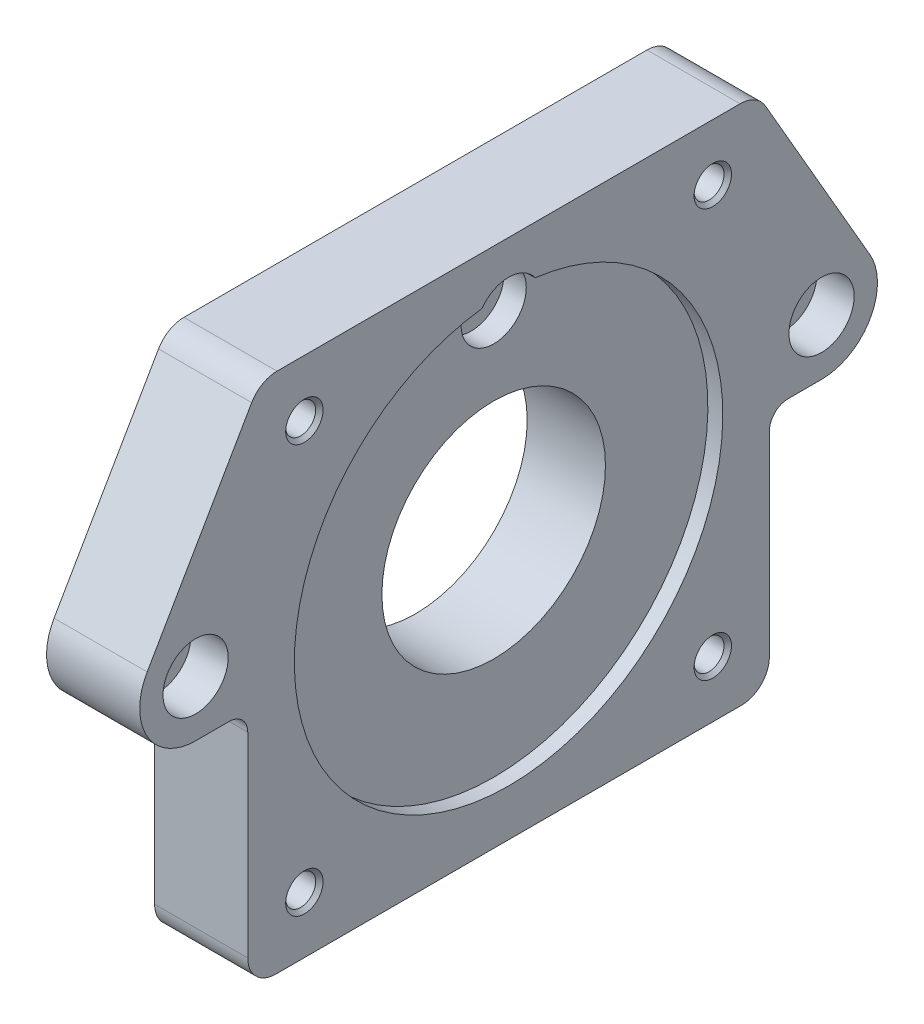
ISO-10303-21;
HEADER;
FILE_DESCRIPTION(('STEP AP214'),'2;1');
FILE_NAME('part.step','',(''),(''),'','','');
FILE_SCHEMA(('AUTOMOTIVE_DESIGN { 1 0 10303 214 1 1 1 1 }'));
ENDSEC;
DATA;
#1=APPLICATION_CONTEXT('core data for automotive mechanical design processes');
#2=APPLICATION_PROTOCOL_DEFINITION('international standard','automotive_design',2000,#1);
#3=PRODUCT_CONTEXT('',#1,'mechanical');
#4=PRODUCT('Part','Part','',(#3));
#5=PRODUCT_RELATED_PRODUCT_CATEGORY('part','',(#4));
#6=PRODUCT_DEFINITION_FORMATION('','',#4);
#7=PRODUCT_DEFINITION_CONTEXT('part definition',#1,'design');
#8=PRODUCT_DEFINITION('design','',#6,#7);
#9=PRODUCT_DEFINITION_SHAPE('','',#8);
#10=(LENGTH_UNIT() NAMED_UNIT(*) SI_UNIT(.MILLI.,.METRE.));
#11=(NAMED_UNIT(*) PLANE_ANGLE_UNIT() SI_UNIT($,.RADIAN.));
#12=(NAMED_UNIT(*) SI_UNIT($,.STERADIAN.) SOLID_ANGLE_UNIT());
#13=UNCERTAINTY_MEASURE_WITH_UNIT(LENGTH_MEASURE(1.E-05),#10,'distance_accuracy_value','');
#14=(GEOMETRIC_REPRESENTATION_CONTEXT(3) GLOBAL_UNCERTAINTY_ASSIGNED_CONTEXT((#13)) GLOBAL_UNIT_ASSIGNED_CONTEXT((#10,
#11,#12)) REPRESENTATION_CONTEXT('',''));
#15=CARTESIAN_POINT('',(0.,0.,0.));
#16=DIRECTION('',(0.,0.,1.));
#17=DIRECTION('',(1.,0.,0.));
#18=AXIS2_PLACEMENT_3D('',#15,#16,#17);
#19=CARTESIAN_POINT('',(15.875,6.35,-53.34));
#20=DIRECTION('',(-1.,0.,0.));
#21=DIRECTION('',(0.,0.,1.));
#22=AXIS2_PLACEMENT_3D('',#19,#20,#21);
#23=PLANE('',#22);
#24=CARTESIAN_POINT('',(15.875,-34.8,-34.8));
#25=DIRECTION('',(1.,0.,0.));
#26=DIRECTION('',(0.,0.,-1.));
#27=AXIS2_PLACEMENT_3D('',#24,#25,#26);
#28=CIRCLE('',#27,3.1877);
#29=CARTESIAN_POINT('',(15.875,-34.8,-37.9877));
#30=VERTEX_POINT('',#29);
#31=EDGE_CURVE('E833',#30,#30,#28,.T.);
#32=ORIENTED_EDGE('',*,*,#31,.F.);
#33=EDGE_LOOP('',(#32));
#34=FACE_BOUND('',#33,.T.);
#35=CARTESIAN_POINT('',(15.875,34.8,34.8));
#36=DIRECTION('',(1.,0.,0.));
#37=DIRECTION('',(0.,0.,-1.));
#38=AXIS2_PLACEMENT_3D('',#35,#36,#37);
#39=CIRCLE('',#38,3.1877);
#40=CARTESIAN_POINT('',(15.875,34.8,31.6123));
#41=VERTEX_POINT('',#40);
#42=EDGE_CURVE('E321',#41,#41,#39,.T.);
#43=ORIENTED_EDGE('',*,*,#42,.F.);
#44=EDGE_LOOP('',(#43));
#45=FACE_BOUND('',#44,.T.);
#46=CARTESIAN_POINT('',(15.875,34.8,-34.8));
#47=DIRECTION('',(1.,0.,0.));
#48=DIRECTION('',(0.,0.,-1.));
#49=AXIS2_PLACEMENT_3D('',#46,#47,#48);
#50=CIRCLE('',#49,3.1877);
#51=CARTESIAN_POINT('',(15.875,34.8,-37.9877));
#52=VERTEX_POINT('',#51);
#53=EDGE_CURVE('E310',#52,#52,#50,.T.);
#54=ORIENTED_EDGE('',*,*,#53,.F.);
#55=EDGE_LOOP('',(#54));
#56=FACE_BOUND('',#55,.T.);
#57=CARTESIAN_POINT('',(15.875,6.35,53.34));
#58=DIRECTION('',(1.,0.,0.));
#59=DIRECTION('',(0.,0.,-1.));
#60=AXIS2_PLACEMENT_3D('',#57,#58,#59);
#61=CIRCLE('',#60,5.55625);
#62=CARTESIAN_POINT('',(15.875,6.35,47.78375));
#63=VERTEX_POINT('',#62);
#64=EDGE_CURVE('E306',#63,#63,#61,.T.);
#65=ORIENTED_EDGE('',*,*,#64,.F.);
#66=EDGE_LOOP('',(#65));
#67=FACE_BOUND('',#66,.T.);
#68=CARTESIAN_POINT('',(15.875,6.35,-53.34));
#69=DIRECTION('',(1.,0.,0.));
#70=DIRECTION('',(0.,0.,-1.));
#71=AXIS2_PLACEMENT_3D('',#68,#69,#70);
#72=CIRCLE('',#71,5.55625);
#73=CARTESIAN_POINT('',(15.875,6.35,-58.89625));
#74=VERTEX_POINT('',#73);
#75=EDGE_CURVE('E346',#74,#74,#72,.T.);
#76=ORIENTED_EDGE('',*,*,#75,.F.);
#77=EDGE_LOOP('',(#76));
#78=FACE_BOUND('',#77,.T.);
#79=CARTESIAN_POINT('',(15.875,0.,0.));
#80=DIRECTION('',(1.,0.,0.));
#81=DIRECTION('',(0.,0.,-1.));
#82=AXIS2_PLACEMENT_3D('',#79,#80,#81);
#83=CIRCLE('',#82,36.5099981);
#84=CARTESIAN_POINT('',(15.875,36.2269601332451,4.53732528768621));
#85=VERTEX_POINT('',#84);
#86=CARTESIAN_POINT('',(15.875,36.2269601332451,-4.53732528768621));
#87=VERTEX_POINT('',#86);
#88=EDGE_CURVE('E173',#85,#87,#83,.T.);
#89=ORIENTED_EDGE('',*,*,#88,.F.);
#90=CARTESIAN_POINT('',(15.875,33.02,0.));
#91=DIRECTION('',(1.,0.,0.));
#92=DIRECTION('',(0.,0.,-1.));
#93=AXIS2_PLACEMENT_3D('',#90,#91,#92);
#94=CIRCLE('',#93,5.55625);
#95=EDGE_CURVE('E164',#87,#85,#94,.T.);
#96=ORIENTED_EDGE('',*,*,#95,.F.);
#97=EDGE_LOOP('',(#89,#96));
#98=FACE_BOUND('',#97,.T.);
#99=DIRECTION('',(0.,0.,-1.));
#100=VECTOR('',#99,1.);
#101=CARTESIAN_POINT('',(15.875,-44.45,44.45));
#102=LINE('',#101,#100);
#103=CARTESIAN_POINT('',(15.875,-44.45,39.6748));
#104=VERTEX_POINT('',#103);
#105=CARTESIAN_POINT('',(15.875,-44.45,-39.6748));
#106=VERTEX_POINT('',#105);
#107=EDGE_CURVE('E189',#104,#106,#102,.T.);
#108=ORIENTED_EDGE('',*,*,#107,.T.);
#109=CARTESIAN_POINT('',(15.875,-39.6748,-39.6748));
#110=DIRECTION('',(-1.,0.,0.));
#111=DIRECTION('',(0.,0.,1.));
#112=AXIS2_PLACEMENT_3D('',#109,#110,#111);
#113=CIRCLE('',#112,4.7752);
#114=CARTESIAN_POINT('',(15.875,-39.6748,-44.45));
#115=VERTEX_POINT('',#114);
#116=EDGE_CURVE('E298',#106,#115,#113,.F.);
#117=ORIENTED_EDGE('',*,*,#116,.T.);
#118=DIRECTION('',(0.,1.,0.));
#119=VECTOR('',#118,1.);
#120=CARTESIAN_POINT('',(15.875,-44.45,-44.45));
#121=LINE('',#120,#119);
#122=CARTESIAN_POINT('',(15.875,-6.35000000000001,-44.45));
#123=VERTEX_POINT('',#122);
#124=EDGE_CURVE('E192',#115,#123,#121,.T.);
#125=ORIENTED_EDGE('',*,*,#124,.T.);
#126=CARTESIAN_POINT('',(15.875,-6.35000000000001,-47.625));
#127=DIRECTION('',(-1.,0.,0.));
#128=DIRECTION('',(0.,0.,1.));
#129=AXIS2_PLACEMENT_3D('',#126,#127,#128);
#130=CIRCLE('',#129,3.175);
#131=CARTESIAN_POINT('',(15.875,-3.17500000000001,-47.625));
#132=VERTEX_POINT('',#131);
#133=EDGE_CURVE('E278',#123,#132,#130,.T.);
#134=ORIENTED_EDGE('',*,*,#133,.T.);
#135=DIRECTION('',(0.,0.,-1.));
#136=VECTOR('',#135,1.);
#137=CARTESIAN_POINT('',(15.875,-3.175,-53.34));
#138=LINE('',#137,#136);
#139=CARTESIAN_POINT('',(15.875,-3.17500000000001,-53.34));
#140=VERTEX_POINT('',#139);
#141=EDGE_CURVE('E195',#132,#140,#138,.T.);
#142=ORIENTED_EDGE('',*,*,#141,.T.);
#143=CARTESIAN_POINT('',(15.875,6.35,-53.34));
#144=DIRECTION('',(1.,0.,0.));
#145=DIRECTION('',(0.,0.,1.));
#146=AXIS2_PLACEMENT_3D('',#143,#144,#145);
#147=CIRCLE('',#146,9.525);
#148=CARTESIAN_POINT('',(15.875,11.1125,-61.5888919710468));
#149=VERTEX_POINT('',#148);
#150=EDGE_CURVE('E197',#140,#149,#147,.T.);
#151=ORIENTED_EDGE('',*,*,#150,.T.);
#152=DIRECTION('',(0.,0.866025403784436,0.500000000000004));
#153=VECTOR('',#152,1.);
#154=CARTESIAN_POINT('',(15.875,41.9555909487749,-43.7816251091313));
#155=LINE('',#154,#153);
#156=CARTESIAN_POINT('',(15.875,41.9555909487749,-43.7816251091313));
#157=VERTEX_POINT('',#156);
#158=EDGE_CURVE('E199',#149,#157,#155,.T.);
#159=ORIENTED_EDGE('',*,*,#158,.T.);
#160=CARTESIAN_POINT('',(15.875,39.4611818975497,-39.4611818975497));
#161=DIRECTION('',(1.,0.,0.));
#162=DIRECTION('',(0.,0.,1.));
#163=AXIS2_PLACEMENT_3D('',#160,#161,#162);
#164=CIRCLE('',#163,4.9888181024503);
#165=CARTESIAN_POINT('',(15.875,44.45,-39.4611818975497));
#166=VERTEX_POINT('',#165);
#167=EDGE_CURVE('E201',#157,#166,#164,.T.);
#168=ORIENTED_EDGE('',*,*,#167,.T.);
#169=DIRECTION('',(0.,0.,1.));
#170=VECTOR('',#169,1.);
#171=CARTESIAN_POINT('',(15.875,44.45,39.4611818975497));
#172=LINE('',#171,#170);
#173=CARTESIAN_POINT('',(15.875,44.45,39.4611818975497));
#174=VERTEX_POINT('',#173);
#175=EDGE_CURVE('E203',#166,#174,#172,.T.);
#176=ORIENTED_EDGE('',*,*,#175,.T.);
#177=CARTESIAN_POINT('',(15.875,39.4611818975497,39.4611818975497));
#178=DIRECTION('',(1.,0.,0.));
#179=DIRECTION('',(0.,0.,-1.));
#180=AXIS2_PLACEMENT_3D('',#177,#178,#179);
#181=CIRCLE('',#180,4.9888181024503);
#182=CARTESIAN_POINT('',(15.875,41.9555909487749,43.7816251091313));
#183=VERTEX_POINT('',#182);
#184=EDGE_CURVE('E205',#174,#183,#181,.T.);
#185=ORIENTED_EDGE('',*,*,#184,.T.);
#186=DIRECTION('',(0.,-0.866025403784436,0.500000000000004));
#187=VECTOR('',#186,1.);
#188=CARTESIAN_POINT('',(15.875,41.9555909487749,43.7816251091313));
#189=LINE('',#188,#187);
#190=CARTESIAN_POINT('',(15.875,11.1125,61.5888919710468));
#191=VERTEX_POINT('',#190);
#192=EDGE_CURVE('E207',#183,#191,#189,.T.);
#193=ORIENTED_EDGE('',*,*,#192,.T.);
#194=CARTESIAN_POINT('',(15.875,6.35,53.34));
#195=DIRECTION('',(1.,0.,0.));
#196=DIRECTION('',(0.,0.,1.));
#197=AXIS2_PLACEMENT_3D('',#194,#195,#196);
#198=CIRCLE('',#197,9.525);
#199=CARTESIAN_POINT('',(15.875,-3.175,53.34));
#200=VERTEX_POINT('',#199);
#201=EDGE_CURVE('E209',#191,#200,#198,.T.);
#202=ORIENTED_EDGE('',*,*,#201,.T.);
#203=DIRECTION('',(0.,0.,-1.));
#204=VECTOR('',#203,1.);
#205=CARTESIAN_POINT('',(15.875,-3.175,53.34));
#206=LINE('',#205,#204);
#207=CARTESIAN_POINT('',(15.875,-3.17500000000001,47.625));
#208=VERTEX_POINT('',#207);
#209=EDGE_CURVE('E211',#200,#208,#206,.T.);
#210=ORIENTED_EDGE('',*,*,#209,.T.);
#211=CARTESIAN_POINT('',(15.875,-6.35000000000001,47.625));
#212=DIRECTION('',(-1.,0.,0.));
#213=DIRECTION('',(0.,0.,1.));
#214=AXIS2_PLACEMENT_3D('',#211,#212,#213);
#215=CIRCLE('',#214,3.175);
#216=CARTESIAN_POINT('',(15.875,-6.35000000000001,44.45));
#217=VERTEX_POINT('',#216);
#218=EDGE_CURVE('E282',#208,#217,#215,.T.);
#219=ORIENTED_EDGE('',*,*,#218,.T.);
#220=DIRECTION('',(0.,-1.,0.));
#221=VECTOR('',#220,1.);
#222=CARTESIAN_POINT('',(15.875,-3.17500000000002,44.45));
#223=LINE('',#222,#221);
#224=CARTESIAN_POINT('',(15.875,-39.6748,44.45));
#225=VERTEX_POINT('',#224);
#226=EDGE_CURVE('E214',#217,#225,#223,.T.);
#227=ORIENTED_EDGE('',*,*,#226,.T.);
#228=CARTESIAN_POINT('',(15.875,-39.6748,39.6748));
#229=DIRECTION('',(-1.,0.,0.));
#230=DIRECTION('',(0.,0.,1.));
#231=AXIS2_PLACEMENT_3D('',#228,#229,#230);
#232=CIRCLE('',#231,4.7752);
#233=EDGE_CURVE('E296',#225,#104,#232,.F.);
#234=ORIENTED_EDGE('',*,*,#233,.T.);
#235=EDGE_LOOP('',(#108,#117,#125,#134,#142,#151,#159,#168,#176,#185,#193,#202,#210,#219,#227,#234));
#236=FACE_BOUND('',#235,.T.);
#237=CARTESIAN_POINT('',(15.875,-34.8,34.8));
#238=DIRECTION('',(1.,0.,0.));
#239=DIRECTION('',(0.,0.,-1.));
#240=AXIS2_PLACEMENT_3D('',#237,#238,#239);
#241=CIRCLE('',#240,3.1877);
#242=CARTESIAN_POINT('',(15.875,-34.8,31.6123));
#243=VERTEX_POINT('',#242);
#244=EDGE_CURVE('E314',#243,#243,#241,.T.);
#245=ORIENTED_EDGE('',*,*,#244,.F.);
#246=EDGE_LOOP('',(#245));
#247=FACE_BOUND('',#246,.T.);
#248=ADVANCED_FACE('F36',(#34,#45,#56,#67,#78,#98,#236,#247),#23,.F.);
#249=CARTESIAN_POINT('',(15.875,0.,0.));
#250=DIRECTION('',(-1.,0.,0.));
#251=DIRECTION('',(0.,0.,1.));
#252=AXIS2_PLACEMENT_3D('',#249,#250,#251);
#253=CYLINDRICAL_SURFACE('',#252,19.05);
#254=CARTESIAN_POINT('',(0.,0.,0.));
#255=DIRECTION('',(1.,0.,0.));
#256=DIRECTION('',(0.,0.,-1.));
#257=AXIS2_PLACEMENT_3D('',#254,#255,#256);
#258=CIRCLE('',#257,19.05);
#259=CARTESIAN_POINT('',(0.,0.,-19.05));
#260=VERTEX_POINT('',#259);
#261=EDGE_CURVE('E185',#260,#260,#258,.T.);
#262=ORIENTED_EDGE('',*,*,#261,.F.);
#263=EDGE_LOOP('',(#262));
#264=FACE_BOUND('',#263,.T.);
#265=CARTESIAN_POINT('',(13.335,0.,0.));
#266=DIRECTION('',(1.,0.,0.));
#267=DIRECTION('',(0.,0.,-1.));
#268=AXIS2_PLACEMENT_3D('',#265,#266,#267);
#269=CIRCLE('',#268,19.05);
#270=CARTESIAN_POINT('',(13.335,0.,-19.05));
#271=VERTEX_POINT('',#270);
#272=EDGE_CURVE('E180',#271,#271,#269,.T.);
#273=ORIENTED_EDGE('',*,*,#272,.T.);
#274=EDGE_LOOP('',(#273));
#275=FACE_BOUND('',#274,.T.);
#276=ADVANCED_FACE('F391',(#264,#275),#253,.F.);
#277=CARTESIAN_POINT('',(0.,6.35,-53.34));
#278=DIRECTION('',(-1.,0.,0.));
#279=DIRECTION('',(0.,0.,1.));
#280=AXIS2_PLACEMENT_3D('',#277,#278,#279);
#281=PLANE('',#280);
#282=CARTESIAN_POINT('',(0.,-34.8,-34.8));
#283=DIRECTION('',(-1.,0.,0.));
#284=DIRECTION('',(0.,0.,1.));
#285=AXIS2_PLACEMENT_3D('',#282,#283,#284);
#286=CIRCLE('',#285,2.55269999999999);
#287=CARTESIAN_POINT('',(0.,-34.8,-32.2473));
#288=VERTEX_POINT('',#287);
#289=EDGE_CURVE('E40',#288,#288,#286,.T.);
#290=ORIENTED_EDGE('',*,*,#289,.F.);
#291=EDGE_LOOP('',(#290));
#292=FACE_BOUND('',#291,.T.);
#293=CARTESIAN_POINT('',(0.,34.8,34.8));
#294=DIRECTION('',(-1.,0.,0.));
#295=DIRECTION('',(0.,0.,1.));
#296=AXIS2_PLACEMENT_3D('',#293,#294,#295);
#297=CIRCLE('',#296,2.55269999999999);
#298=CARTESIAN_POINT('',(0.,34.8,37.3527));
#299=VERTEX_POINT('',#298);
#300=EDGE_CURVE('E312',#299,#299,#297,.T.);
#301=ORIENTED_EDGE('',*,*,#300,.F.);
#302=EDGE_LOOP('',(#301));
#303=FACE_BOUND('',#302,.T.);
#304=CARTESIAN_POINT('',(0.,-34.8,34.8));
#305=DIRECTION('',(-1.,0.,0.));
#306=DIRECTION('',(0.,0.,1.));
#307=AXIS2_PLACEMENT_3D('',#304,#305,#306);
#308=CIRCLE('',#307,2.55269999999999);
#309=CARTESIAN_POINT('',(0.,-34.8,37.3527));
#310=VERTEX_POINT('',#309);
#311=EDGE_CURVE('E308',#310,#310,#308,.T.);
#312=ORIENTED_EDGE('',*,*,#311,.F.);
#313=EDGE_LOOP('',(#312));
#314=FACE_BOUND('',#313,.T.);
#315=CARTESIAN_POINT('',(0.,34.8,-34.8));
#316=DIRECTION('',(-1.,0.,0.));
#317=DIRECTION('',(0.,0.,1.));
#318=AXIS2_PLACEMENT_3D('',#315,#316,#317);
#319=CIRCLE('',#318,2.55269999999999);
#320=CARTESIAN_POINT('',(0.,34.8,-32.2473));
#321=VERTEX_POINT('',#320);
#322=EDGE_CURVE('E303',#321,#321,#319,.T.);
#323=ORIENTED_EDGE('',*,*,#322,.F.);
#324=EDGE_LOOP('',(#323));
#325=FACE_BOUND('',#324,.T.);
#326=CARTESIAN_POINT('',(0.,6.35,53.34));
#327=DIRECTION('',(1.,0.,0.));
#328=DIRECTION('',(0.,0.,-1.));
#329=AXIS2_PLACEMENT_3D('',#326,#327,#328);
#330=CIRCLE('',#329,3.2639);
#331=CARTESIAN_POINT('',(0.,6.35,50.0761));
#332=VERTEX_POINT('',#331);
#333=EDGE_CURVE('E343',#332,#332,#330,.T.);
#334=ORIENTED_EDGE('',*,*,#333,.T.);
#335=EDGE_LOOP('',(#334));
#336=FACE_BOUND('',#335,.T.);
#337=CARTESIAN_POINT('',(0.,6.35,-53.34));
#338=DIRECTION('',(1.,0.,0.));
#339=DIRECTION('',(0.,0.,-1.));
#340=AXIS2_PLACEMENT_3D('',#337,#338,#339);
#341=CIRCLE('',#340,3.2639);
#342=CARTESIAN_POINT('',(0.,6.35,-56.6039));
#343=VERTEX_POINT('',#342);
#344=EDGE_CURVE('E175',#343,#343,#341,.T.);
#345=ORIENTED_EDGE('',*,*,#344,.T.);
#346=EDGE_LOOP('',(#345));
#347=FACE_BOUND('',#346,.T.);
#348=CARTESIAN_POINT('',(0.,33.02,0.));
#349=DIRECTION('',(1.,0.,0.));
#350=DIRECTION('',(0.,0.,-1.));
#351=AXIS2_PLACEMENT_3D('',#348,#349,#350);
#352=CIRCLE('',#351,3.26389999999999);
#353=CARTESIAN_POINT('',(0.,33.02,-3.26389999999999));
#354=VERTEX_POINT('',#353);
#355=EDGE_CURVE('E182',#354,#354,#352,.T.);
#356=ORIENTED_EDGE('',*,*,#355,.T.);
#357=EDGE_LOOP('',(#356));
#358=FACE_BOUND('',#357,.T.);
#359=DIRECTION('',(0.,1.,0.));
#360=VECTOR('',#359,1.);
#361=CARTESIAN_POINT('',(0.,-44.45,-44.45));
#362=LINE('',#361,#360);
#363=CARTESIAN_POINT('',(0.,-39.6748,-44.45));
#364=VERTEX_POINT('',#363);
#365=CARTESIAN_POINT('',(0.,-6.35000000000001,-44.45));
#366=VERTEX_POINT('',#365);
#367=EDGE_CURVE('E219',#364,#366,#362,.T.);
#368=ORIENTED_EDGE('',*,*,#367,.F.);
#369=CARTESIAN_POINT('',(0.,-39.6748,-39.6748));
#370=DIRECTION('',(-1.,0.,0.));
#371=DIRECTION('',(0.,0.,1.));
#372=AXIS2_PLACEMENT_3D('',#369,#370,#371);
#373=CIRCLE('',#372,4.7752);
#374=CARTESIAN_POINT('',(0.,-44.45,-39.6748));
#375=VERTEX_POINT('',#374);
#376=EDGE_CURVE('E289',#364,#375,#373,.T.);
#377=ORIENTED_EDGE('',*,*,#376,.T.);
#378=DIRECTION('',(0.,0.,-1.));
#379=VECTOR('',#378,1.);
#380=CARTESIAN_POINT('',(0.,-44.45,44.45));
#381=LINE('',#380,#379);
#382=CARTESIAN_POINT('',(0.,-44.45,39.6748));
#383=VERTEX_POINT('',#382);
#384=EDGE_CURVE('E188',#383,#375,#381,.T.);
#385=ORIENTED_EDGE('',*,*,#384,.F.);
#386=CARTESIAN_POINT('',(0.,-39.6748,39.6748));
#387=DIRECTION('',(-1.,0.,0.));
#388=DIRECTION('',(0.,0.,1.));
#389=AXIS2_PLACEMENT_3D('',#386,#387,#388);
#390=CIRCLE('',#389,4.7752);
#391=CARTESIAN_POINT('',(0.,-39.6748,44.45));
#392=VERTEX_POINT('',#391);
#393=EDGE_CURVE('E287',#383,#392,#390,.T.);
#394=ORIENTED_EDGE('',*,*,#393,.T.);
#395=DIRECTION('',(0.,-1.,0.));
#396=VECTOR('',#395,1.);
#397=CARTESIAN_POINT('',(0.,-3.17500000000002,44.45));
#398=LINE('',#397,#396);
#399=CARTESIAN_POINT('',(0.,-6.35000000000001,44.45));
#400=VERTEX_POINT('',#399);
#401=EDGE_CURVE('E193',#400,#392,#398,.T.);
#402=ORIENTED_EDGE('',*,*,#401,.F.);
#403=CARTESIAN_POINT('',(0.,-6.35000000000001,47.625));
#404=DIRECTION('',(-1.,0.,0.));
#405=DIRECTION('',(0.,0.,1.));
#406=AXIS2_PLACEMENT_3D('',#403,#404,#405);
#407=CIRCLE('',#406,3.175);
#408=CARTESIAN_POINT('',(0.,-3.17500000000001,47.625));
#409=VERTEX_POINT('',#408);
#410=EDGE_CURVE('E280',#400,#409,#407,.F.);
#411=ORIENTED_EDGE('',*,*,#410,.T.);
#412=DIRECTION('',(0.,0.,-1.));
#413=VECTOR('',#412,1.);
#414=CARTESIAN_POINT('',(0.,-3.175,53.34));
#415=LINE('',#414,#413);
#416=CARTESIAN_POINT('',(0.,-3.175,53.34));
#417=VERTEX_POINT('',#416);
#418=EDGE_CURVE('E237',#417,#409,#415,.T.);
#419=ORIENTED_EDGE('',*,*,#418,.F.);
#420=CARTESIAN_POINT('',(0.,6.35,53.34));
#421=DIRECTION('',(1.,0.,0.));
#422=DIRECTION('',(0.,0.,1.));
#423=AXIS2_PLACEMENT_3D('',#420,#421,#422);
#424=CIRCLE('',#423,9.525);
#425=CARTESIAN_POINT('',(0.,11.1125,61.5888919710468));
#426=VERTEX_POINT('',#425);
#427=EDGE_CURVE('E235',#426,#417,#424,.T.);
#428=ORIENTED_EDGE('',*,*,#427,.F.);
#429=DIRECTION('',(0.,-0.866025403784436,0.500000000000004));
#430=VECTOR('',#429,1.);
#431=CARTESIAN_POINT('',(0.,41.9555909487749,43.7816251091313));
#432=LINE('',#431,#430);
#433=CARTESIAN_POINT('',(0.,41.9555909487749,43.7816251091313));
#434=VERTEX_POINT('',#433);
#435=EDGE_CURVE('E233',#434,#426,#432,.T.);
#436=ORIENTED_EDGE('',*,*,#435,.F.);
#437=CARTESIAN_POINT('',(0.,39.4611818975497,39.4611818975497));
#438=DIRECTION('',(1.,0.,0.));
#439=DIRECTION('',(0.,0.,-1.));
#440=AXIS2_PLACEMENT_3D('',#437,#438,#439);
#441=CIRCLE('',#440,4.9888181024503);
#442=CARTESIAN_POINT('',(0.,44.45,39.4611818975497));
#443=VERTEX_POINT('',#442);
#444=EDGE_CURVE('E231',#443,#434,#441,.T.);
#445=ORIENTED_EDGE('',*,*,#444,.F.);
#446=DIRECTION('',(0.,0.,1.));
#447=VECTOR('',#446,1.);
#448=CARTESIAN_POINT('',(0.,44.45,39.4611818975497));
#449=LINE('',#448,#447);
#450=CARTESIAN_POINT('',(0.,44.45,-39.4611818975497));
#451=VERTEX_POINT('',#450);
#452=EDGE_CURVE('E229',#451,#443,#449,.T.);
#453=ORIENTED_EDGE('',*,*,#452,.F.);
#454=CARTESIAN_POINT('',(0.,39.4611818975497,-39.4611818975497));
#455=DIRECTION('',(1.,0.,0.));
#456=DIRECTION('',(0.,0.,1.));
#457=AXIS2_PLACEMENT_3D('',#454,#455,#456);
#458=CIRCLE('',#457,4.9888181024503);
#459=CARTESIAN_POINT('',(0.,41.9555909487749,-43.7816251091313));
#460=VERTEX_POINT('',#459);
#461=EDGE_CURVE('E227',#460,#451,#458,.T.);
#462=ORIENTED_EDGE('',*,*,#461,.F.);
#463=DIRECTION('',(0.,0.866025403784436,0.500000000000004));
#464=VECTOR('',#463,1.);
#465=CARTESIAN_POINT('',(0.,41.9555909487749,-43.7816251091313));
#466=LINE('',#465,#464);
#467=CARTESIAN_POINT('',(0.,11.1125,-61.5888919710468));
#468=VERTEX_POINT('',#467);
#469=EDGE_CURVE('E225',#468,#460,#466,.T.);
#470=ORIENTED_EDGE('',*,*,#469,.F.);
#471=CARTESIAN_POINT('',(0.,6.35,-53.34));
#472=DIRECTION('',(1.,0.,0.));
#473=DIRECTION('',(0.,0.,1.));
#474=AXIS2_PLACEMENT_3D('',#471,#472,#473);
#475=CIRCLE('',#474,9.525);
#476=CARTESIAN_POINT('',(0.,-3.17500000000001,-53.34));
#477=VERTEX_POINT('',#476);
#478=EDGE_CURVE('E223',#477,#468,#475,.T.);
#479=ORIENTED_EDGE('',*,*,#478,.F.);
#480=DIRECTION('',(0.,0.,-1.));
#481=VECTOR('',#480,1.);
#482=CARTESIAN_POINT('',(0.,-3.175,-53.34));
#483=LINE('',#482,#481);
#484=CARTESIAN_POINT('',(0.,-3.17500000000001,-47.625));
#485=VERTEX_POINT('',#484);
#486=EDGE_CURVE('E221',#485,#477,#483,.T.);
#487=ORIENTED_EDGE('',*,*,#486,.F.);
#488=CARTESIAN_POINT('',(0.,-6.35000000000001,-47.625));
#489=DIRECTION('',(-1.,0.,0.));
#490=DIRECTION('',(0.,0.,1.));
#491=AXIS2_PLACEMENT_3D('',#488,#489,#490);
#492=CIRCLE('',#491,3.175);
#493=EDGE_CURVE('E275',#485,#366,#492,.F.);
#494=ORIENTED_EDGE('',*,*,#493,.T.);
#495=EDGE_LOOP('',(#368,#377,#385,#394,#402,#411,#419,#428,#436,#445,#453,#462,#470,#479,#487,#494));
#496=FACE_BOUND('',#495,.T.);
#497=ORIENTED_EDGE('',*,*,#261,.T.);
#498=EDGE_LOOP('',(#497));
#499=FACE_BOUND('',#498,.T.);
#500=ADVANCED_FACE('F365',(#292,#303,#314,#325,#336,#347,#358,#496,#499),#281,.T.);
#501=CARTESIAN_POINT('',(15.875,-44.45,44.45));
#502=DIRECTION('',(0.,1.,0.));
#503=DIRECTION('',(0.,0.,1.));
#504=AXIS2_PLACEMENT_3D('',#501,#502,#503);
#505=PLANE('',#504);
#506=ORIENTED_EDGE('',*,*,#384,.T.);
#507=DIRECTION('',(-1.,0.,0.));
#508=VECTOR('',#507,1.);
#509=CARTESIAN_POINT('',(15.875,-44.45,-39.6748));
#510=LINE('',#509,#508);
#511=EDGE_CURVE('E294',#375,#106,#510,.F.);
#512=ORIENTED_EDGE('',*,*,#511,.T.);
#513=ORIENTED_EDGE('',*,*,#107,.F.);
#514=DIRECTION('',(-1.,0.,0.));
#515=VECTOR('',#514,1.);
#516=CARTESIAN_POINT('',(15.875,-44.45,39.6748));
#517=LINE('',#516,#515);
#518=EDGE_CURVE('E291',#104,#383,#517,.T.);
#519=ORIENTED_EDGE('',*,*,#518,.T.);
#520=EDGE_LOOP('',(#506,#512,#513,#519));
#521=FACE_BOUND('',#520,.T.);
#522=ADVANCED_FACE('F405',(#521),#505,.F.);
#523=CARTESIAN_POINT('',(15.875,-44.45,-44.45));
#524=DIRECTION('',(0.,0.,1.));
#525=DIRECTION('',(0.,-1.,0.));
#526=AXIS2_PLACEMENT_3D('',#523,#524,#525);
#527=PLANE('',#526);
#528=ORIENTED_EDGE('',*,*,#124,.F.);
#529=DIRECTION('',(-1.,0.,0.));
#530=VECTOR('',#529,1.);
#531=CARTESIAN_POINT('',(15.875,-39.6748,-44.45));
#532=LINE('',#531,#530);
#533=EDGE_CURVE('E284',#115,#364,#532,.T.);
#534=ORIENTED_EDGE('',*,*,#533,.T.);
#535=ORIENTED_EDGE('',*,*,#367,.T.);
#536=DIRECTION('',(-1.,0.,0.));
#537=VECTOR('',#536,1.);
#538=CARTESIAN_POINT('',(15.875,-6.35000000000001,-44.45));
#539=LINE('',#538,#537);
#540=EDGE_CURVE('E267',#366,#123,#539,.F.);
#541=ORIENTED_EDGE('',*,*,#540,.T.);
#542=EDGE_LOOP('',(#528,#534,#535,#541));
#543=FACE_BOUND('',#542,.T.);
#544=ADVANCED_FACE('F446',(#543),#527,.F.);
#545=CARTESIAN_POINT('',(15.875,-3.175,-53.34));
#546=DIRECTION('',(0.,1.,0.));
#547=DIRECTION('',(0.,0.,1.));
#548=AXIS2_PLACEMENT_3D('',#545,#546,#547);
#549=PLANE('',#548);
#550=ORIENTED_EDGE('',*,*,#141,.F.);
#551=DIRECTION('',(-1.,0.,0.));
#552=VECTOR('',#551,1.);
#553=CARTESIAN_POINT('',(0.,-3.17500000000001,-47.625));
#554=LINE('',#553,#552);
#555=EDGE_CURVE('E264',#132,#485,#554,.T.);
#556=ORIENTED_EDGE('',*,*,#555,.T.);
#557=ORIENTED_EDGE('',*,*,#486,.T.);
#558=DIRECTION('',(-1.,0.,0.));
#559=VECTOR('',#558,1.);
#560=CARTESIAN_POINT('',(15.875,-3.17500000000001,-53.34));
#561=LINE('',#560,#559);
#562=EDGE_CURVE('E261',#140,#477,#561,.T.);
#563=ORIENTED_EDGE('',*,*,#562,.F.);
#564=EDGE_LOOP('',(#550,#556,#557,#563));
#565=FACE_BOUND('',#564,.T.);
#566=ADVANCED_FACE('F442',(#565),#549,.F.);
#567=CARTESIAN_POINT('',(15.875,6.35,-53.34));
#568=DIRECTION('',(-1.,0.,0.));
#569=DIRECTION('',(0.,0.,1.));
#570=AXIS2_PLACEMENT_3D('',#567,#568,#569);
#571=CYLINDRICAL_SURFACE('',#570,9.525);
#572=ORIENTED_EDGE('',*,*,#478,.T.);
#573=DIRECTION('',(-1.,0.,0.));
#574=VECTOR('',#573,1.);
#575=CARTESIAN_POINT('',(15.875,11.1125,-61.5888919710468));
#576=LINE('',#575,#574);
#577=EDGE_CURVE('E258',#149,#468,#576,.T.);
#578=ORIENTED_EDGE('',*,*,#577,.F.);
#579=ORIENTED_EDGE('',*,*,#150,.F.);
#580=ORIENTED_EDGE('',*,*,#562,.T.);
#581=EDGE_LOOP('',(#572,#578,#579,#580));
#582=FACE_BOUND('',#581,.T.);
#583=ADVANCED_FACE('F438',(#582),#571,.T.);
#584=CARTESIAN_POINT('',(15.875,41.9555909487749,-43.7816251091313));
#585=DIRECTION('',(0.,-0.500000000000004,0.866025403784436));
#586=DIRECTION('',(0.,-0.866025403784436,-0.500000000000004));
#587=AXIS2_PLACEMENT_3D('',#584,#585,#586);
#588=PLANE('',#587);
#589=ORIENTED_EDGE('',*,*,#469,.T.);
#590=DIRECTION('',(-1.,0.,0.));
#591=VECTOR('',#590,1.);
#592=CARTESIAN_POINT('',(15.875,41.9555909487749,-43.7816251091313));
#593=LINE('',#592,#591);
#594=EDGE_CURVE('E255',#157,#460,#593,.T.);
#595=ORIENTED_EDGE('',*,*,#594,.F.);
#596=ORIENTED_EDGE('',*,*,#158,.F.);
#597=ORIENTED_EDGE('',*,*,#577,.T.);
#598=EDGE_LOOP('',(#589,#595,#596,#597));
#599=FACE_BOUND('',#598,.T.);
#600=ADVANCED_FACE('F434',(#599),#588,.F.);
#601=CARTESIAN_POINT('',(15.875,39.4611818975497,-39.4611818975497));
#602=DIRECTION('',(-1.,0.,0.));
#603=DIRECTION('',(0.,0.,1.));
#604=AXIS2_PLACEMENT_3D('',#601,#602,#603);
#605=CYLINDRICAL_SURFACE('',#604,4.9888181024503);
#606=ORIENTED_EDGE('',*,*,#461,.T.);
#607=DIRECTION('',(-1.,0.,0.));
#608=VECTOR('',#607,1.);
#609=CARTESIAN_POINT('',(15.875,44.45,-39.4611818975497));
#610=LINE('',#609,#608);
#611=EDGE_CURVE('E252',#166,#451,#610,.T.);
#612=ORIENTED_EDGE('',*,*,#611,.F.);
#613=ORIENTED_EDGE('',*,*,#167,.F.);
#614=ORIENTED_EDGE('',*,*,#594,.T.);
#615=EDGE_LOOP('',(#606,#612,#613,#614));
#616=FACE_BOUND('',#615,.T.);
#617=ADVANCED_FACE('F430',(#616),#605,.T.);
#618=CARTESIAN_POINT('',(15.875,44.45,39.4611818975497));
#619=DIRECTION('',(0.,-1.,0.));
#620=DIRECTION('',(0.,0.,-1.));
#621=AXIS2_PLACEMENT_3D('',#618,#619,#620);
#622=PLANE('',#621);
#623=ORIENTED_EDGE('',*,*,#452,.T.);
#624=DIRECTION('',(-1.,0.,0.));
#625=VECTOR('',#624,1.);
#626=CARTESIAN_POINT('',(15.875,44.45,39.4611818975497));
#627=LINE('',#626,#625);
#628=EDGE_CURVE('E249',#174,#443,#627,.T.);
#629=ORIENTED_EDGE('',*,*,#628,.F.);
#630=ORIENTED_EDGE('',*,*,#175,.F.);
#631=ORIENTED_EDGE('',*,*,#611,.T.);
#632=EDGE_LOOP('',(#623,#629,#630,#631));
#633=FACE_BOUND('',#632,.T.);
#634=ADVANCED_FACE('F426',(#633),#622,.F.);
#635=CARTESIAN_POINT('',(15.875,39.4611818975497,39.4611818975497));
#636=DIRECTION('',(-1.,0.,0.));
#637=DIRECTION('',(0.,0.,1.));
#638=AXIS2_PLACEMENT_3D('',#635,#636,#637);
#639=CYLINDRICAL_SURFACE('',#638,4.9888181024503);
#640=ORIENTED_EDGE('',*,*,#444,.T.);
#641=DIRECTION('',(-1.,0.,0.));
#642=VECTOR('',#641,1.);
#643=CARTESIAN_POINT('',(15.875,41.9555909487749,43.7816251091313));
#644=LINE('',#643,#642);
#645=EDGE_CURVE('E246',#183,#434,#644,.T.);
#646=ORIENTED_EDGE('',*,*,#645,.F.);
#647=ORIENTED_EDGE('',*,*,#184,.F.);
#648=ORIENTED_EDGE('',*,*,#628,.T.);
#649=EDGE_LOOP('',(#640,#646,#647,#648));
#650=FACE_BOUND('',#649,.T.);
#651=ADVANCED_FACE('F422',(#650),#639,.T.);
#652=CARTESIAN_POINT('',(15.875,41.9555909487749,43.7816251091313));
#653=DIRECTION('',(0.,-0.500000000000004,-0.866025403784436));
#654=DIRECTION('',(0.,0.866025403784436,-0.500000000000004));
#655=AXIS2_PLACEMENT_3D('',#652,#653,#654);
#656=PLANE('',#655);
#657=ORIENTED_EDGE('',*,*,#435,.T.);
#658=DIRECTION('',(-1.,0.,0.));
#659=VECTOR('',#658,1.);
#660=CARTESIAN_POINT('',(15.875,11.1125,61.5888919710468));
#661=LINE('',#660,#659);
#662=EDGE_CURVE('E243',#191,#426,#661,.T.);
#663=ORIENTED_EDGE('',*,*,#662,.F.);
#664=ORIENTED_EDGE('',*,*,#192,.F.);
#665=ORIENTED_EDGE('',*,*,#645,.T.);
#666=EDGE_LOOP('',(#657,#663,#664,#665));
#667=FACE_BOUND('',#666,.T.);
#668=ADVANCED_FACE('F418',(#667),#656,.F.);
#669=CARTESIAN_POINT('',(15.875,6.35,53.34));
#670=DIRECTION('',(-1.,0.,0.));
#671=DIRECTION('',(0.,0.,1.));
#672=AXIS2_PLACEMENT_3D('',#669,#670,#671);
#673=CYLINDRICAL_SURFACE('',#672,9.525);
#674=ORIENTED_EDGE('',*,*,#427,.T.);
#675=DIRECTION('',(-1.,0.,0.));
#676=VECTOR('',#675,1.);
#677=CARTESIAN_POINT('',(15.875,-3.175,53.34));
#678=LINE('',#677,#676);
#679=EDGE_CURVE('E216',#200,#417,#678,.T.);
#680=ORIENTED_EDGE('',*,*,#679,.F.);
#681=ORIENTED_EDGE('',*,*,#201,.F.);
#682=ORIENTED_EDGE('',*,*,#662,.T.);
#683=EDGE_LOOP('',(#674,#680,#681,#682));
#684=FACE_BOUND('',#683,.T.);
#685=ADVANCED_FACE('F414',(#684),#673,.T.);
#686=CARTESIAN_POINT('',(15.875,-3.175,53.34));
#687=DIRECTION('',(0.,1.,0.));
#688=DIRECTION('',(0.,0.,1.));
#689=AXIS2_PLACEMENT_3D('',#686,#687,#688);
#690=PLANE('',#689);
#691=ORIENTED_EDGE('',*,*,#418,.T.);
#692=DIRECTION('',(-1.,0.,0.));
#693=VECTOR('',#692,1.);
#694=CARTESIAN_POINT('',(15.875,-3.17500000000001,47.625));
#695=LINE('',#694,#693);
#696=EDGE_CURVE('E273',#409,#208,#695,.F.);
#697=ORIENTED_EDGE('',*,*,#696,.T.);
#698=ORIENTED_EDGE('',*,*,#209,.F.);
#699=ORIENTED_EDGE('',*,*,#679,.T.);
#700=EDGE_LOOP('',(#691,#697,#698,#699));
#701=FACE_BOUND('',#700,.T.);
#702=ADVANCED_FACE('F411',(#701),#690,.F.);
#703=CARTESIAN_POINT('',(15.875,-3.17500000000002,44.45));
#704=DIRECTION('',(0.,0.,-1.));
#705=DIRECTION('',(0.,1.,0.));
#706=AXIS2_PLACEMENT_3D('',#703,#704,#705);
#707=PLANE('',#706);
#708=ORIENTED_EDGE('',*,*,#401,.T.);
#709=DIRECTION('',(-1.,0.,0.));
#710=VECTOR('',#709,1.);
#711=CARTESIAN_POINT('',(15.875,-39.6748,44.45));
#712=LINE('',#711,#710);
#713=EDGE_CURVE('E61',#392,#225,#712,.F.);
#714=ORIENTED_EDGE('',*,*,#713,.T.);
#715=ORIENTED_EDGE('',*,*,#226,.F.);
#716=DIRECTION('',(-1.,0.,0.));
#717=VECTOR('',#716,1.);
#718=CARTESIAN_POINT('',(0.,-6.35000000000001,44.45));
#719=LINE('',#718,#717);
#720=EDGE_CURVE('E270',#217,#400,#719,.T.);
#721=ORIENTED_EDGE('',*,*,#720,.T.);
#722=EDGE_LOOP('',(#708,#714,#715,#721));
#723=FACE_BOUND('',#722,.T.);
#724=ADVANCED_FACE('F407',(#723),#707,.F.);
#725=CARTESIAN_POINT('',(15.875,-6.35000000000001,-47.625));
#726=DIRECTION('',(1.,0.,0.));
#727=DIRECTION('',(0.,0.,-1.));
#728=AXIS2_PLACEMENT_3D('',#725,#726,#727);
#729=CYLINDRICAL_SURFACE('',#728,3.175);
#730=ORIENTED_EDGE('',*,*,#133,.F.);
#731=ORIENTED_EDGE('',*,*,#540,.F.);
#732=ORIENTED_EDGE('',*,*,#493,.F.);
#733=ORIENTED_EDGE('',*,*,#555,.F.);
#734=EDGE_LOOP('',(#730,#731,#732,#733));
#735=FACE_BOUND('',#734,.T.);
#736=ADVANCED_FACE('F410',(#735),#729,.F.);
#737=CARTESIAN_POINT('',(15.875,-6.35000000000001,47.625));
#738=DIRECTION('',(1.,0.,0.));
#739=DIRECTION('',(0.,0.,-1.));
#740=AXIS2_PLACEMENT_3D('',#737,#738,#739);
#741=CYLINDRICAL_SURFACE('',#740,3.175);
#742=ORIENTED_EDGE('',*,*,#218,.F.);
#743=ORIENTED_EDGE('',*,*,#696,.F.);
#744=ORIENTED_EDGE('',*,*,#410,.F.);
#745=ORIENTED_EDGE('',*,*,#720,.F.);
#746=EDGE_LOOP('',(#742,#743,#744,#745));
#747=FACE_BOUND('',#746,.T.);
#748=ADVANCED_FACE('F456',(#747),#741,.F.);
#749=CARTESIAN_POINT('',(15.875,-39.6748,-39.6748));
#750=DIRECTION('',(-1.,0.,0.));
#751=DIRECTION('',(0.,0.,1.));
#752=AXIS2_PLACEMENT_3D('',#749,#750,#751);
#753=CYLINDRICAL_SURFACE('',#752,4.7752);
#754=ORIENTED_EDGE('',*,*,#116,.F.);
#755=ORIENTED_EDGE('',*,*,#511,.F.);
#756=ORIENTED_EDGE('',*,*,#376,.F.);
#757=ORIENTED_EDGE('',*,*,#533,.F.);
#758=EDGE_LOOP('',(#754,#755,#756,#757));
#759=FACE_BOUND('',#758,.T.);
#760=ADVANCED_FACE('F459',(#759),#753,.T.);
#761=CARTESIAN_POINT('',(15.875,-39.6748,39.6748));
#762=DIRECTION('',(-1.,0.,0.));
#763=DIRECTION('',(0.,0.,1.));
#764=AXIS2_PLACEMENT_3D('',#761,#762,#763);
#765=CYLINDRICAL_SURFACE('',#764,4.7752);
#766=ORIENTED_EDGE('',*,*,#233,.F.);
#767=ORIENTED_EDGE('',*,*,#713,.F.);
#768=ORIENTED_EDGE('',*,*,#393,.F.);
#769=ORIENTED_EDGE('',*,*,#518,.F.);
#770=EDGE_LOOP('',(#766,#767,#768,#769));
#771=FACE_BOUND('',#770,.T.);
#772=ADVANCED_FACE('F38',(#771),#765,.T.);
#773=CARTESIAN_POINT('',(13.335,0.,0.));
#774=DIRECTION('',(1.,0.,0.));
#775=DIRECTION('',(0.,0.,-1.));
#776=AXIS2_PLACEMENT_3D('',#773,#774,#775);
#777=CYLINDRICAL_SURFACE('',#776,36.5099981);
#778=CARTESIAN_POINT('',(13.335,0.,0.));
#779=DIRECTION('',(1.,0.,0.));
#780=DIRECTION('',(0.,0.,-1.));
#781=AXIS2_PLACEMENT_3D('',#778,#779,#780);
#782=CIRCLE('',#781,36.5099981);
#783=CARTESIAN_POINT('',(13.335,36.2269601332451,4.5373252876862));
#784=VERTEX_POINT('',#783);
#785=CARTESIAN_POINT('',(13.335,36.2269601332451,-4.53732528768621));
#786=VERTEX_POINT('',#785);
#787=EDGE_CURVE('E178',#784,#786,#782,.T.);
#788=ORIENTED_EDGE('',*,*,#787,.F.);
#789=DIRECTION('',(1.,0.,0.));
#790=VECTOR('',#789,1.);
#791=CARTESIAN_POINT('',(12.7,36.2269601332451,4.53732528768621));
#792=LINE('',#791,#790);
#793=EDGE_CURVE('E11',#784,#85,#792,.T.);
#794=ORIENTED_EDGE('',*,*,#793,.T.);
#795=ORIENTED_EDGE('',*,*,#88,.T.);
#796=DIRECTION('',(1.,0.,0.));
#797=VECTOR('',#796,1.);
#798=CARTESIAN_POINT('',(12.7,36.2269601332451,-4.53732528768621));
#799=LINE('',#798,#797);
#800=EDGE_CURVE('E45',#87,#786,#799,.F.);
#801=ORIENTED_EDGE('',*,*,#800,.T.);
#802=EDGE_LOOP('',(#788,#794,#795,#801));
#803=FACE_BOUND('',#802,.T.);
#804=ADVANCED_FACE('F177',(#803),#777,.F.);
#805=CARTESIAN_POINT('',(13.335,0.,0.));
#806=DIRECTION('',(1.,0.,0.));
#807=DIRECTION('',(0.,0.,-1.));
#808=AXIS2_PLACEMENT_3D('',#805,#806,#807);
#809=PLANE('',#808);
#810=CARTESIAN_POINT('',(13.335,33.02,0.));
#811=DIRECTION('',(1.,0.,0.));
#812=DIRECTION('',(0.,0.,-1.));
#813=AXIS2_PLACEMENT_3D('',#810,#811,#812);
#814=CIRCLE('',#813,5.55625);
#815=EDGE_CURVE('E53',#784,#786,#814,.T.);
#816=ORIENTED_EDGE('',*,*,#815,.F.);
#817=ORIENTED_EDGE('',*,*,#787,.T.);
#818=EDGE_LOOP('',(#816,#817));
#819=FACE_BOUND('',#818,.T.);
#820=ORIENTED_EDGE('',*,*,#272,.F.);
#821=EDGE_LOOP('',(#820));
#822=FACE_BOUND('',#821,.T.);
#823=ADVANCED_FACE('F382',(#819,#822),#809,.T.);
#824=CARTESIAN_POINT('',(15.875,33.02,0.));
#825=DIRECTION('',(1.,0.,0.));
#826=DIRECTION('',(0.,0.,-1.));
#827=AXIS2_PLACEMENT_3D('',#824,#825,#826);
#828=CYLINDRICAL_SURFACE('',#827,5.55625);
#829=CARTESIAN_POINT('',(9.525,33.02,0.));
#830=DIRECTION('',(1.,0.,0.));
#831=DIRECTION('',(0.,0.,-1.));
#832=AXIS2_PLACEMENT_3D('',#829,#830,#831);
#833=CIRCLE('',#832,5.55625);
#834=CARTESIAN_POINT('',(9.525,33.02,-5.55625));
#835=VERTEX_POINT('',#834);
#836=EDGE_CURVE('E174',#835,#835,#833,.T.);
#837=ORIENTED_EDGE('',*,*,#836,.F.);
#838=EDGE_LOOP('',(#837));
#839=FACE_BOUND('',#838,.T.);
#840=ORIENTED_EDGE('',*,*,#815,.T.);
#841=ORIENTED_EDGE('',*,*,#800,.F.);
#842=ORIENTED_EDGE('',*,*,#95,.T.);
#843=ORIENTED_EDGE('',*,*,#793,.F.);
#844=EDGE_LOOP('',(#840,#841,#842,#843));
#845=FACE_BOUND('',#844,.T.);
#846=ADVANCED_FACE('F163',(#839,#845),#828,.F.);
#847=CARTESIAN_POINT('',(15.875,33.02,0.));
#848=DIRECTION('',(1.,0.,0.));
#849=DIRECTION('',(0.,0.,-1.));
#850=AXIS2_PLACEMENT_3D('',#847,#848,#849);
#851=CYLINDRICAL_SURFACE('',#850,3.2639);
#852=ORIENTED_EDGE('',*,*,#355,.F.);
#853=EDGE_LOOP('',(#852));
#854=FACE_BOUND('',#853,.T.);
#855=CARTESIAN_POINT('',(9.525,33.02,0.));
#856=DIRECTION('',(1.,0.,0.));
#857=DIRECTION('',(0.,0.,-1.));
#858=AXIS2_PLACEMENT_3D('',#855,#856,#857);
#859=CIRCLE('',#858,3.2639);
#860=CARTESIAN_POINT('',(9.525,33.02,-3.2639));
#861=VERTEX_POINT('',#860);
#862=EDGE_CURVE('E359',#861,#861,#859,.T.);
#863=ORIENTED_EDGE('',*,*,#862,.T.);
#864=EDGE_LOOP('',(#863));
#865=FACE_BOUND('',#864,.T.);
#866=ADVANCED_FACE('F368',(#854,#865),#851,.F.);
#867=CARTESIAN_POINT('',(9.525,36.2839,0.));
#868=DIRECTION('',(-1.,0.,0.));
#869=DIRECTION('',(0.,0.,1.));
#870=AXIS2_PLACEMENT_3D('',#867,#868,#869);
#871=PLANE('',#870);
#872=ORIENTED_EDGE('',*,*,#862,.F.);
#873=EDGE_LOOP('',(#872));
#874=FACE_BOUND('',#873,.T.);
#875=ORIENTED_EDGE('',*,*,#836,.T.);
#876=EDGE_LOOP('',(#875));
#877=FACE_BOUND('',#876,.T.);
#878=ADVANCED_FACE('F371',(#874,#877),#871,.F.);
#879=CARTESIAN_POINT('',(15.875,6.35,-53.34));
#880=DIRECTION('',(1.,0.,0.));
#881=DIRECTION('',(0.,0.,-1.));
#882=AXIS2_PLACEMENT_3D('',#879,#880,#881);
#883=CYLINDRICAL_SURFACE('',#882,3.2639);
#884=ORIENTED_EDGE('',*,*,#344,.F.);
#885=EDGE_LOOP('',(#884));
#886=FACE_BOUND('',#885,.T.);
#887=CARTESIAN_POINT('',(9.525,6.35,-53.34));
#888=DIRECTION('',(1.,0.,0.));
#889=DIRECTION('',(0.,0.,-1.));
#890=AXIS2_PLACEMENT_3D('',#887,#888,#889);
#891=CIRCLE('',#890,3.2639);
#892=CARTESIAN_POINT('',(9.525,6.35,-56.6039));
#893=VERTEX_POINT('',#892);
#894=EDGE_CURVE('E352',#893,#893,#891,.T.);
#895=ORIENTED_EDGE('',*,*,#894,.T.);
#896=EDGE_LOOP('',(#895));
#897=FACE_BOUND('',#896,.T.);
#898=ADVANCED_FACE('F377',(#886,#897),#883,.F.);
#899=CARTESIAN_POINT('',(9.525,9.6139,-53.34));
#900=DIRECTION('',(-1.,0.,0.));
#901=DIRECTION('',(0.,0.,1.));
#902=AXIS2_PLACEMENT_3D('',#899,#900,#901);
#903=PLANE('',#902);
#904=ORIENTED_EDGE('',*,*,#894,.F.);
#905=EDGE_LOOP('',(#904));
#906=FACE_BOUND('',#905,.T.);
#907=CARTESIAN_POINT('',(9.525,6.35,-53.34));
#908=DIRECTION('',(1.,0.,0.));
#909=DIRECTION('',(0.,0.,-1.));
#910=AXIS2_PLACEMENT_3D('',#907,#908,#909);
#911=CIRCLE('',#910,5.55625);
#912=CARTESIAN_POINT('',(9.525,6.35,-58.89625));
#913=VERTEX_POINT('',#912);
#914=EDGE_CURVE('E349',#913,#913,#911,.T.);
#915=ORIENTED_EDGE('',*,*,#914,.T.);
#916=EDGE_LOOP('',(#915));
#917=FACE_BOUND('',#916,.T.);
#918=ADVANCED_FACE('F557',(#906,#917),#903,.F.);
#919=CARTESIAN_POINT('',(15.875,6.35,-53.34));
#920=DIRECTION('',(1.,0.,0.));
#921=DIRECTION('',(0.,0.,-1.));
#922=AXIS2_PLACEMENT_3D('',#919,#920,#921);
#923=CYLINDRICAL_SURFACE('',#922,5.55625);
#924=ORIENTED_EDGE('',*,*,#914,.F.);
#925=EDGE_LOOP('',(#924));
#926=FACE_BOUND('',#925,.T.);
#927=ORIENTED_EDGE('',*,*,#75,.T.);
#928=EDGE_LOOP('',(#927));
#929=FACE_BOUND('',#928,.T.);
#930=ADVANCED_FACE('F553',(#926,#929),#923,.F.);
#931=CARTESIAN_POINT('',(15.875,6.35,53.34));
#932=DIRECTION('',(1.,0.,0.));
#933=DIRECTION('',(0.,0.,-1.));
#934=AXIS2_PLACEMENT_3D('',#931,#932,#933);
#935=CYLINDRICAL_SURFACE('',#934,3.2639);
#936=ORIENTED_EDGE('',*,*,#333,.F.);
#937=EDGE_LOOP('',(#936));
#938=FACE_BOUND('',#937,.T.);
#939=CARTESIAN_POINT('',(9.525,6.35,53.34));
#940=DIRECTION('',(1.,0.,0.));
#941=DIRECTION('',(0.,0.,-1.));
#942=AXIS2_PLACEMENT_3D('',#939,#940,#941);
#943=CIRCLE('',#942,3.2639);
#944=CARTESIAN_POINT('',(9.525,6.35,50.0761));
#945=VERTEX_POINT('',#944);
#946=EDGE_CURVE('E340',#945,#945,#943,.T.);
#947=ORIENTED_EDGE('',*,*,#946,.T.);
#948=EDGE_LOOP('',(#947));
#949=FACE_BOUND('',#948,.T.);
#950=ADVANCED_FACE('F549',(#938,#949),#935,.F.);
#951=CARTESIAN_POINT('',(9.525,9.6139,53.34));
#952=DIRECTION('',(-1.,0.,0.));
#953=DIRECTION('',(0.,0.,1.));
#954=AXIS2_PLACEMENT_3D('',#951,#952,#953);
#955=PLANE('',#954);
#956=ORIENTED_EDGE('',*,*,#946,.F.);
#957=EDGE_LOOP('',(#956));
#958=FACE_BOUND('',#957,.T.);
#959=CARTESIAN_POINT('',(9.525,6.35,53.34));
#960=DIRECTION('',(1.,0.,0.));
#961=DIRECTION('',(0.,0.,-1.));
#962=AXIS2_PLACEMENT_3D('',#959,#960,#961);
#963=CIRCLE('',#962,5.55625);
#964=CARTESIAN_POINT('',(9.525,6.35,47.78375));
#965=VERTEX_POINT('',#964);
#966=EDGE_CURVE('E337',#965,#965,#963,.T.);
#967=ORIENTED_EDGE('',*,*,#966,.T.);
#968=EDGE_LOOP('',(#967));
#969=FACE_BOUND('',#968,.T.);
#970=ADVANCED_FACE('F545',(#958,#969),#955,.F.);
#971=CARTESIAN_POINT('',(15.875,6.35,53.34));
#972=DIRECTION('',(1.,0.,0.));
#973=DIRECTION('',(0.,0.,-1.));
#974=AXIS2_PLACEMENT_3D('',#971,#972,#973);
#975=CYLINDRICAL_SURFACE('',#974,5.55625);
#976=ORIENTED_EDGE('',*,*,#966,.F.);
#977=EDGE_LOOP('',(#976));
#978=FACE_BOUND('',#977,.T.);
#979=ORIENTED_EDGE('',*,*,#64,.T.);
#980=EDGE_LOOP('',(#979));
#981=FACE_BOUND('',#980,.T.);
#982=ADVANCED_FACE('F541',(#978,#981),#975,.F.);
#983=CARTESIAN_POINT('',(15.875,34.8,-34.8));
#984=DIRECTION('',(1.,0.,0.));
#985=DIRECTION('',(0.,0.,-1.));
#986=AXIS2_PLACEMENT_3D('',#983,#984,#985);
#987=CYLINDRICAL_SURFACE('',#986,2.55269999999999);
#988=ORIENTED_EDGE('',*,*,#322,.T.);
#989=EDGE_LOOP('',(#988));
#990=FACE_BOUND('',#989,.T.);
#991=CARTESIAN_POINT('',(15.24,34.8,-34.8));
#992=DIRECTION('',(1.,0.,0.));
#993=DIRECTION('',(0.,0.,-1.));
#994=AXIS2_PLACEMENT_3D('',#991,#992,#993);
#995=CIRCLE('',#994,2.5527);
#996=CARTESIAN_POINT('',(15.24,34.8,-37.3527));
#997=VERTEX_POINT('',#996);
#998=EDGE_CURVE('E307',#997,#997,#995,.T.);
#999=ORIENTED_EDGE('',*,*,#998,.T.);
#1000=EDGE_LOOP('',(#999));
#1001=FACE_BOUND('',#1000,.T.);
#1002=ADVANCED_FACE('F537',(#990,#1001),#987,.F.);
#1003=CARTESIAN_POINT('',(15.875,34.8,-34.8));
#1004=DIRECTION('',(1.,0.,0.));
#1005=DIRECTION('',(0.,0.,-1.));
#1006=AXIS2_PLACEMENT_3D('',#1003,#1004,#1005);
#1007=CONICAL_SURFACE('',#1006,3.1877,0.785398163397448);
#1008=ORIENTED_EDGE('',*,*,#998,.F.);
#1009=EDGE_LOOP('',(#1008));
#1010=FACE_BOUND('',#1009,.T.);
#1011=ORIENTED_EDGE('',*,*,#53,.T.);
#1012=EDGE_LOOP('',(#1011));
#1013=FACE_BOUND('',#1012,.T.);
#1014=ADVANCED_FACE('F529',(#1010,#1013),#1007,.F.);
#1015=CARTESIAN_POINT('',(15.875,-34.8,34.8));
#1016=DIRECTION('',(1.,0.,0.));
#1017=DIRECTION('',(0.,0.,-1.));
#1018=AXIS2_PLACEMENT_3D('',#1015,#1016,#1017);
#1019=CYLINDRICAL_SURFACE('',#1018,2.55269999999999);
#1020=ORIENTED_EDGE('',*,*,#311,.T.);
#1021=EDGE_LOOP('',(#1020));
#1022=FACE_BOUND('',#1021,.T.);
#1023=CARTESIAN_POINT('',(15.24,-34.8,34.8));
#1024=DIRECTION('',(1.,0.,0.));
#1025=DIRECTION('',(0.,0.,-1.));
#1026=AXIS2_PLACEMENT_3D('',#1023,#1024,#1025);
#1027=CIRCLE('',#1026,2.5527);
#1028=CARTESIAN_POINT('',(15.24,-34.8,32.2473));
#1029=VERTEX_POINT('',#1028);
#1030=EDGE_CURVE('E311',#1029,#1029,#1027,.T.);
#1031=ORIENTED_EDGE('',*,*,#1030,.T.);
#1032=EDGE_LOOP('',(#1031));
#1033=FACE_BOUND('',#1032,.T.);
#1034=ADVANCED_FACE('F520',(#1022,#1033),#1019,.F.);
#1035=CARTESIAN_POINT('',(15.875,-34.8,34.8));
#1036=DIRECTION('',(1.,0.,0.));
#1037=DIRECTION('',(0.,0.,-1.));
#1038=AXIS2_PLACEMENT_3D('',#1035,#1036,#1037);
#1039=CONICAL_SURFACE('',#1038,3.1877,0.785398163397448);
#1040=ORIENTED_EDGE('',*,*,#1030,.F.);
#1041=EDGE_LOOP('',(#1040));
#1042=FACE_BOUND('',#1041,.T.);
#1043=ORIENTED_EDGE('',*,*,#244,.T.);
#1044=EDGE_LOOP('',(#1043));
#1045=FACE_BOUND('',#1044,.T.);
#1046=ADVANCED_FACE('F517',(#1042,#1045),#1039,.F.);
#1047=CARTESIAN_POINT('',(15.875,34.8,34.8));
#1048=DIRECTION('',(1.,0.,0.));
#1049=DIRECTION('',(0.,0.,-1.));
#1050=AXIS2_PLACEMENT_3D('',#1047,#1048,#1049);
#1051=CYLINDRICAL_SURFACE('',#1050,2.55269999999999);
#1052=ORIENTED_EDGE('',*,*,#300,.T.);
#1053=EDGE_LOOP('',(#1052));
#1054=FACE_BOUND('',#1053,.T.);
#1055=CARTESIAN_POINT('',(15.24,34.8,34.8));
#1056=DIRECTION('',(1.,0.,0.));
#1057=DIRECTION('',(0.,0.,-1.));
#1058=AXIS2_PLACEMENT_3D('',#1055,#1056,#1057);
#1059=CIRCLE('',#1058,2.5527);
#1060=CARTESIAN_POINT('',(15.24,34.8,32.2473));
#1061=VERTEX_POINT('',#1060);
#1062=EDGE_CURVE('E315',#1061,#1061,#1059,.T.);
#1063=ORIENTED_EDGE('',*,*,#1062,.T.);
#1064=EDGE_LOOP('',(#1063));
#1065=FACE_BOUND('',#1064,.T.);
#1066=ADVANCED_FACE('F519',(#1054,#1065),#1051,.F.);
#1067=CARTESIAN_POINT('',(15.875,34.8,34.8));
#1068=DIRECTION('',(1.,0.,0.));
#1069=DIRECTION('',(0.,0.,-1.));
#1070=AXIS2_PLACEMENT_3D('',#1067,#1068,#1069);
#1071=CONICAL_SURFACE('',#1070,3.1877,0.785398163397448);
#1072=ORIENTED_EDGE('',*,*,#1062,.F.);
#1073=EDGE_LOOP('',(#1072));
#1074=FACE_BOUND('',#1073,.T.);
#1075=ORIENTED_EDGE('',*,*,#42,.T.);
#1076=EDGE_LOOP('',(#1075));
#1077=FACE_BOUND('',#1076,.T.);
#1078=ADVANCED_FACE('F527',(#1074,#1077),#1071,.F.);
#1079=CARTESIAN_POINT('',(15.875,-34.8,-34.8));
#1080=DIRECTION('',(1.,0.,0.));
#1081=DIRECTION('',(0.,0.,-1.));
#1082=AXIS2_PLACEMENT_3D('',#1079,#1080,#1081);
#1083=CYLINDRICAL_SURFACE('',#1082,2.55269999999999);
#1084=ORIENTED_EDGE('',*,*,#289,.T.);
#1085=EDGE_LOOP('',(#1084));
#1086=FACE_BOUND('',#1085,.T.);
#1087=CARTESIAN_POINT('',(15.24,-34.8,-34.8));
#1088=DIRECTION('',(1.,0.,0.));
#1089=DIRECTION('',(0.,0.,-1.));
#1090=AXIS2_PLACEMENT_3D('',#1087,#1088,#1089);
#1091=CIRCLE('',#1090,2.5527);
#1092=CARTESIAN_POINT('',(15.24,-34.8,-37.3527));
#1093=VERTEX_POINT('',#1092);
#1094=EDGE_CURVE('E831',#1093,#1093,#1091,.T.);
#1095=ORIENTED_EDGE('',*,*,#1094,.T.);
#1096=EDGE_LOOP('',(#1095));
#1097=FACE_BOUND('',#1096,.T.);
#1098=ADVANCED_FACE('F622',(#1086,#1097),#1083,.F.);
#1099=CARTESIAN_POINT('',(15.875,-34.8,-34.8));
#1100=DIRECTION('',(1.,0.,0.));
#1101=DIRECTION('',(0.,0.,-1.));
#1102=AXIS2_PLACEMENT_3D('',#1099,#1100,#1101);
#1103=CONICAL_SURFACE('',#1102,3.1877,0.785398163397448);
#1104=ORIENTED_EDGE('',*,*,#1094,.F.);
#1105=EDGE_LOOP('',(#1104));
#1106=FACE_BOUND('',#1105,.T.);
#1107=ORIENTED_EDGE('',*,*,#31,.T.);
#1108=EDGE_LOOP('',(#1107));
#1109=FACE_BOUND('',#1108,.T.);
#1110=ADVANCED_FACE('F625',(#1106,#1109),#1103,.F.);
#1111=CLOSED_SHELL('',(#248,#276,#500,#522,#544,#566,#583,#600,#617,#634,#651,#668,#685,#702,
#724,#736,#748,#760,#772,#804,#823,#846,#866,#878,#898,#918,#930,#950,#970,#982,#1002,#1014,
#1034,#1046,#1066,#1078,#1098,#1110));
#1112=MANIFOLD_SOLID_BREP('B2',#1111);
#1113=ADVANCED_BREP_SHAPE_REPRESENTATION('',(#18,#1112),#14);
#1114=SHAPE_DEFINITION_REPRESENTATION(#9,#1113);
ENDSEC;
END-ISO-10303-21;
